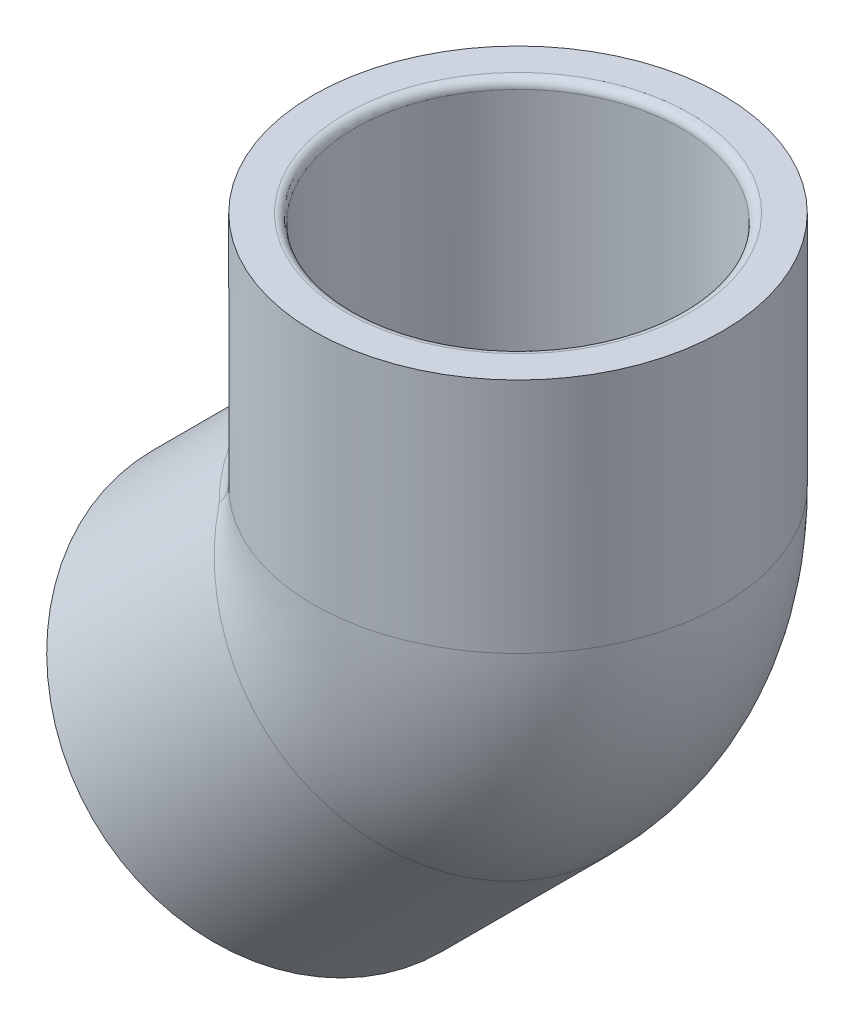
ISO-10303-21;
HEADER;
FILE_DESCRIPTION(('STEP AP214'),'2;1');
FILE_NAME('part.step','',(''),(''),'','','');
FILE_SCHEMA(('AUTOMOTIVE_DESIGN { 1 0 10303 214 1 1 1 1 }'));
ENDSEC;
DATA;
#1=APPLICATION_CONTEXT('core data for automotive mechanical design processes');
#2=APPLICATION_PROTOCOL_DEFINITION('international standard','automotive_design',2000,#1);
#3=PRODUCT_CONTEXT('',#1,'mechanical');
#4=PRODUCT('Part','Part','',(#3));
#5=PRODUCT_RELATED_PRODUCT_CATEGORY('part','',(#4));
#6=PRODUCT_DEFINITION_FORMATION('','',#4);
#7=PRODUCT_DEFINITION_CONTEXT('part definition',#1,'design');
#8=PRODUCT_DEFINITION('design','',#6,#7);
#9=PRODUCT_DEFINITION_SHAPE('','',#8);
#10=(LENGTH_UNIT() NAMED_UNIT(*) SI_UNIT(.MILLI.,.METRE.));
#11=(NAMED_UNIT(*) PLANE_ANGLE_UNIT() SI_UNIT($,.RADIAN.));
#12=(NAMED_UNIT(*) SI_UNIT($,.STERADIAN.) SOLID_ANGLE_UNIT());
#13=UNCERTAINTY_MEASURE_WITH_UNIT(LENGTH_MEASURE(1.E-05),#10,'distance_accuracy_value','');
#14=(GEOMETRIC_REPRESENTATION_CONTEXT(3) GLOBAL_UNCERTAINTY_ASSIGNED_CONTEXT((#13)) GLOBAL_UNIT_ASSIGNED_CONTEXT((#10,
#11,#12)) REPRESENTATION_CONTEXT('',''));
#15=CARTESIAN_POINT('',(0.,0.,0.));
#16=DIRECTION('',(0.,0.,1.));
#17=DIRECTION('',(1.,0.,0.));
#18=AXIS2_PLACEMENT_3D('',#15,#16,#17);
#19=CARTESIAN_POINT('',(-11.2253201513366,-53.8815367264149,0.));
#20=DIRECTION('',(-0.707106781186549,-0.707106781186546,0.));
#21=DIRECTION('',(0.707106781186546,-0.707106781186549,0.));
#22=AXIS2_PLACEMENT_3D('',#19,#20,#21);
#23=PLANE('',#22);
#24=CARTESIAN_POINT('',(-32.5534284388757,-32.5534284388756,0.));
#25=DIRECTION('',(-0.707106781186549,-0.707106781186546,0.));
#26=DIRECTION('',(0.707106781186546,-0.707106781186549,0.));
#27=AXIS2_PLACEMENT_3D('',#24,#25,#26);
#28=CIRCLE('',#27,25.4);
#29=CARTESIAN_POINT('',(-14.5929161967375,-50.513940681014,0.));
#30=VERTEX_POINT('',#29);
#31=EDGE_CURVE('E99',#30,#30,#28,.F.);
#32=ORIENTED_EDGE('',*,*,#31,.T.);
#33=EDGE_LOOP('',(#32));
#34=FACE_BOUND('',#33,.T.);
#35=CARTESIAN_POINT('',(-32.5534284388757,-32.5534284388756,0.));
#36=DIRECTION('',(-0.707106781186549,-0.707106781186546,0.));
#37=DIRECTION('',(0.707106781186546,-0.707106781186549,0.));
#38=AXIS2_PLACEMENT_3D('',#35,#36,#37);
#39=CIRCLE('',#38,30.1625);
#40=CARTESIAN_POINT('',(-11.2253201513366,-53.8815367264149,0.));
#41=VERTEX_POINT('',#40);
#42=EDGE_CURVE('E75',#41,#41,#39,.T.);
#43=ORIENTED_EDGE('',*,*,#42,.T.);
#44=EDGE_LOOP('',(#43));
#45=FACE_BOUND('',#44,.T.);
#46=ADVANCED_FACE('F32',(#34,#45),#23,.T.);
#47=CARTESIAN_POINT('',(-32.5534284388757,-32.5534284388756,0.));
#48=DIRECTION('',(-0.707106781186549,-0.707106781186546,0.));
#49=DIRECTION('',(0.707106781186546,-0.707106781186549,0.));
#50=AXIS2_PLACEMENT_3D('',#47,#48,#49);
#51=CYLINDRICAL_SURFACE('',#50,24.13);
#52=CARTESIAN_POINT('',(-31.6554028267688,-31.6554028267687,0.));
#53=DIRECTION('',(-0.707106781186549,-0.707106781186546,0.));
#54=DIRECTION('',(0.707106781186546,-0.707106781186549,0.));
#55=AXIS2_PLACEMENT_3D('',#52,#53,#54);
#56=CIRCLE('',#55,24.13);
#57=CARTESIAN_POINT('',(-14.5929161967375,-48.7178894568001,0.));
#58=VERTEX_POINT('',#57);
#59=EDGE_CURVE('E96',#58,#58,#56,.T.);
#60=ORIENTED_EDGE('',*,*,#59,.T.);
#61=EDGE_LOOP('',(#60));
#62=FACE_BOUND('',#61,.T.);
#63=CARTESIAN_POINT('',(-7.85772410593552,-7.85772410593549,0.));
#64=DIRECTION('',(-0.707106781186549,-0.707106781186546,0.));
#65=DIRECTION('',(0.707106781186546,-0.707106781186549,0.));
#66=AXIS2_PLACEMENT_3D('',#63,#64,#65);
#67=CIRCLE('',#66,24.13);
#68=CARTESIAN_POINT('',(9.20476252409583,-24.9202107359669,0.));
#69=VERTEX_POINT('',#68);
#70=EDGE_CURVE('E79',#69,#69,#67,.T.);
#71=ORIENTED_EDGE('',*,*,#70,.F.);
#72=EDGE_LOOP('',(#71));
#73=FACE_BOUND('',#72,.T.);
#74=ADVANCED_FACE('F122',(#62,#73),#51,.F.);
#75=CARTESIAN_POINT('',(-32.5534284388757,-32.5534284388756,0.));
#76=DIRECTION('',(-0.707106781186549,-0.707106781186546,0.));
#77=DIRECTION('',(0.707106781186546,-0.707106781186549,0.));
#78=AXIS2_PLACEMENT_3D('',#75,#76,#77);
#79=CYLINDRICAL_SURFACE('',#78,30.1625);
#80=CARTESIAN_POINT('',(-7.85772410593552,-7.8577241059355,0.));
#81=DIRECTION('',(0.707106781186549,0.707106781186546,0.));
#82=DIRECTION('',(-0.707106781186546,0.707106781186549,0.));
#83=AXIS2_PLACEMENT_3D('',#80,#81,#82);
#84=CIRCLE('',#83,30.1625);
#85=CARTESIAN_POINT('',(-23.3930070976355,7.67755888576452,20.6660681065749));
#86=VERTEX_POINT('',#85);
#87=CARTESIAN_POINT('',(-23.3930070976355,7.67755888576453,-20.6660681065749));
#88=VERTEX_POINT('',#87);
#89=EDGE_CURVE('E82',#86,#88,#84,.T.);
#90=ORIENTED_EDGE('',*,*,#89,.F.);
#91=CARTESIAN_POINT('',(0.,0.,0.));
#92=DIRECTION('',(0.311833795922455,0.950136665812131,0.));
#93=DIRECTION('',(0.950136665812131,-0.311833795922455,0.));
#94=AXIS2_PLACEMENT_3D('',#91,#92,#93);
#95=ELLIPSE('',#94,33.8012797196911,30.1625);
#96=EDGE_CURVE('E11',#86,#88,#95,.F.);
#97=ORIENTED_EDGE('',*,*,#96,.T.);
#98=EDGE_LOOP('',(#90,#97));
#99=FACE_BOUND('',#98,.T.);
#100=ORIENTED_EDGE('',*,*,#42,.F.);
#101=EDGE_LOOP('',(#100));
#102=FACE_BOUND('',#101,.T.);
#103=ADVANCED_FACE('F128',(#99,#102),#79,.T.);
#104=CARTESIAN_POINT('',(-7.85772410593552,-7.8577241059355,0.));
#105=DIRECTION('',(0.707106781186549,0.707106781186546,0.));
#106=DIRECTION('',(-0.707106781186546,0.707106781186549,0.));
#107=AXIS2_PLACEMENT_3D('',#104,#105,#106);
#108=PLANE('',#107);
#109=CARTESIAN_POINT('',(-7.85772410593552,-7.8577241059355,0.));
#110=DIRECTION('',(0.707106781186549,0.707106781186546,0.));
#111=DIRECTION('',(-0.707106781186546,0.707106781186549,0.));
#112=AXIS2_PLACEMENT_3D('',#109,#110,#111);
#113=CIRCLE('',#112,18.0975);
#114=CARTESIAN_POINT('',(4.939140866588,-20.6545890784591,0.));
#115=VERTEX_POINT('',#114);
#116=EDGE_CURVE('E149',#115,#115,#113,.T.);
#117=ORIENTED_EDGE('',*,*,#116,.T.);
#118=EDGE_LOOP('',(#117));
#119=FACE_BOUND('',#118,.T.);
#120=ORIENTED_EDGE('',*,*,#70,.T.);
#121=EDGE_LOOP('',(#120));
#122=FACE_BOUND('',#121,.T.);
#123=ADVANCED_FACE('F135',(#119,#122),#108,.F.);
#124=CARTESIAN_POINT('',(-26.827948211871,11.1125,0.));
#125=DIRECTION('',(0.,0.,-1.));
#126=DIRECTION('',(-1.,0.,0.));
#127=AXIS2_PLACEMENT_3D('',#124,#125,#126);
#128=DEGENERATE_TOROIDAL_SURFACE('',#127,26.827948211871,30.1625,.T.);
#129=CARTESIAN_POINT('',(0.,11.1125,0.));
#130=DIRECTION('',(0.,1.,0.));
#131=DIRECTION('',(-1.,0.,0.));
#132=AXIS2_PLACEMENT_3D('',#129,#130,#131);
#133=CIRCLE('',#132,30.1625);
#134=CARTESIAN_POINT('',(-21.9702079021662,11.1125,20.6660681065749));
#135=VERTEX_POINT('',#134);
#136=CARTESIAN_POINT('',(-21.9702079021662,11.1125,-20.6660681065749));
#137=VERTEX_POINT('',#136);
#138=EDGE_CURVE('E71',#135,#137,#133,.T.);
#139=ORIENTED_EDGE('',*,*,#138,.F.);
#140=CARTESIAN_POINT('',(0.,0.,30.1625));
#141=CARTESIAN_POINT('',(0.,0.,30.1625));
#142=CARTESIAN_POINT('',(0.,0.,30.1625));
#143=CARTESIAN_POINT('',(-0.700460831595457,0.229890465099318,30.1624920836448));
#144=CARTESIAN_POINT('',(-0.679161787237688,0.281318023319462,30.1625262585487));
#145=CARTESIAN_POINT('',(-0.657857710778537,0.332743497174967,30.1624920836448));
#146=CARTESIAN_POINT('',(-1.40076448831644,0.459729345579767,30.1409738375808));
#147=CARTESIAN_POINT('',(-1.35830667469442,0.562629046520396,30.1395733360821));
#148=CARTESIAN_POINT('',(-1.31556780630373,0.665412330764075,30.1409738375808));
#149=CARTESIAN_POINT('',(-2.79883257641421,0.918573735609611,30.0549491140271));
#150=CARTESIAN_POINT('',(-2.71339371868768,1.12392447833845,30.0479930241089));
#151=CARTESIAN_POINT('',(-2.62860321165769,1.32954377671897,30.0549491140271));
#152=CARTESIAN_POINT('',(-3.49659692950738,1.14757921946641,29.9904413223232));
#153=CARTESIAN_POINT('',(-3.38961568762119,1.40402478904532,29.9793261662501));
#154=CARTESIAN_POINT('',(-3.28392844796418,1.6610063518973,29.9904413223232));
#155=CARTESIAN_POINT('',(-5.57857650347265,1.83088259775213,29.7329915706843));
#156=CARTESIAN_POINT('',(-5.406322399641,2.23937206049274,29.7054117476464));
#157=CARTESIAN_POINT('',(-5.23927877540043,2.65001977454643,29.7329915706843));
#158=CARTESIAN_POINT('',(-6.95563755955591,2.2828325032622,29.4761220494014));
#159=CARTESIAN_POINT('',(-6.7388386391349,2.79131835897353,29.4319968513309));
#160=CARTESIAN_POINT('',(-6.5325848292076,3.30417214246807,29.4761220494014));
#161=CARTESIAN_POINT('',(-9.6622073063043,3.17112568089264,28.7949979268551));
#162=CARTESIAN_POINT('',(-9.34869610314391,3.87235671642673,28.7104146394436));
#163=CARTESIAN_POINT('',(-9.07453678047196,4.58988783456401,28.7949979268551));
#164=CARTESIAN_POINT('',(-10.99191310983,3.6075336452344,28.3715556082158));
#165=CARTESIAN_POINT('',(-10.6280942188612,4.40230076763141,28.2619828047015));
#166=CARTESIAN_POINT('',(-10.323367802078,5.22154479427024,28.3715556082158));
#167=CARTESIAN_POINT('',(-12.93525022633,4.24533472333214,27.6155879407951));
#168=CARTESIAN_POINT('',(-12.4872330502061,5.17238128590894,27.4669827684332));
#169=CARTESIAN_POINT('',(-12.1485081226576,6.14469818010792,27.6155879407951));
#170=CARTESIAN_POINT('',(-13.5725458656443,4.45449444264717,27.3445165239495));
#171=CARTESIAN_POINT('',(-13.0964249616421,5.42471683771372,27.1819630363369));
#172=CARTESIAN_POINT('',(-12.7470424467161,6.44743599240893,27.3445165239495));
#173=CARTESIAN_POINT('',(-14.8292804697611,4.86695334058256,26.7626264426639));
#174=CARTESIAN_POINT('',(-14.2948491763805,5.92112040093472,26.5717330531804));
#175=CARTESIAN_POINT('',(-13.9273404911298,7.04442906944092,26.7626264426639));
#176=CARTESIAN_POINT('',(-15.4487231226625,5.07025372963283,26.451816060738));
#177=CARTESIAN_POINT('',(-14.8842041083656,6.16523920681437,26.2463391784631));
#178=CARTESIAN_POINT('',(-14.5091076752678,7.33868608614835,26.451816060738));
#179=CARTESIAN_POINT('',(-16.6620419136698,5.4684636060409,25.7939156352507));
#180=CARTESIAN_POINT('',(-16.0354758005896,6.64211155570977,25.5595459196288));
#181=CARTESIAN_POINT('',(-15.6486305240737,7.91505512706705,25.7939156352507));
#182=CARTESIAN_POINT('',(-17.2560879279125,5.6634288465577,25.4471490677351));
#183=CARTESIAN_POINT('',(-16.5976683809079,6.87497934714316,25.1982677729244));
#184=CARTESIAN_POINT('',(-16.2065457327467,8.19724784840986,25.4471490677351));
#185=CARTESIAN_POINT('',(-18.4212846662527,6.04584511885522,24.7161690936644));
#186=CARTESIAN_POINT('',(-17.6971879537199,7.33041526629658,24.4390303405605));
#187=CARTESIAN_POINT('',(-17.3008733872211,8.75075722412895,24.7161690936644));
#188=CARTESIAN_POINT('',(-18.9924406730066,6.23329788439797,24.3319643983004));
#189=CARTESIAN_POINT('',(-18.2345529358977,7.552999129859,24.0408904261862));
#190=CARTESIAN_POINT('',(-17.8372907943797,9.02207638795266,24.3319643983004));
#191=CARTESIAN_POINT('',(-20.1040382185953,6.59812296130698,23.5308842258522));
#192=CARTESIAN_POINT('',(-19.2771151812316,7.98484255149445,23.2134782815492));
#193=CARTESIAN_POINT('',(-18.8812792426451,9.55012426455948,23.5308842258522));
#194=CARTESIAN_POINT('',(-20.644719264376,6.77557387858625,23.1143523213424));
#195=CARTESIAN_POINT('',(-19.78257342913,8.19421021298729,22.7843506131201));
#196=CARTESIAN_POINT('',(-19.3890752235116,9.80696675155408,23.1143523213424));
#197=CARTESIAN_POINT('',(-21.6983985113901,7.12139023438418,22.2467788330612));
#198=CARTESIAN_POINT('',(-20.7644044900852,8.60089795439408,21.8935809717675));
#199=CARTESIAN_POINT('',(-20.3786680545008,10.3075014020834,22.2467788330612));
#200=CARTESIAN_POINT('',(-22.2114032950394,7.28975783324435,21.7957455172257));
#201=CARTESIAN_POINT('',(-21.2407322072117,8.79819935496211,21.4317941493994));
#202=CARTESIAN_POINT('',(-20.8604710866864,10.5511966924968,21.7957455172257));
#203=CARTESIAN_POINT('',(-23.2022689133758,7.61495882604129,20.8651458346211));
#204=CARTESIAN_POINT('',(-22.1576310702755,9.1779912993676,20.4823830065094));
#205=CARTESIAN_POINT('',(-21.791070711912,11.0218926632117,20.8651458346211));
#206=CARTESIAN_POINT('',(-23.6804298021673,7.77189069740103,20.3859097735687));
#207=CARTESIAN_POINT('',(-22.5984385838443,9.36057974988378,19.9949260782647));
#208=CARTESIAN_POINT('',(-22.2401491092974,11.2490358797516,20.3859097735687));
#209=CARTESIAN_POINT('',(-24.6045500445488,8.07518593211792,19.3965648993251));
#210=CARTESIAN_POINT('',(-23.4474557721385,9.71225418396312,18.9921972224219));
#211=CARTESIAN_POINT('',(-23.108062916487,11.6880254526015,19.3965648993251));
#212=CARTESIAN_POINT('',(-25.050517402102,8.22155192236689,18.8864638181787));
#213=CARTESIAN_POINT('',(-23.855551427393,9.88129293911506,18.4768467999678));
#214=CARTESIAN_POINT('',(-23.5269058434409,11.8998756110751,18.8864638181787));
#215=CARTESIAN_POINT('',(-25.9036733431102,8.50155675237832,17.8422339403316));
#216=CARTESIAN_POINT('',(-24.6335726028366,10.2035598617972,17.425666130774));
#217=CARTESIAN_POINT('',(-24.3281715088034,12.3051546483055,17.8422339403316));
#218=CARTESIAN_POINT('',(-26.3112004162958,8.63530668409353,17.3083910667283));
#219=CARTESIAN_POINT('',(-25.0036998434039,10.3568715846439,16.8900280598694));
#220=CARTESIAN_POINT('',(-24.7109121494691,12.498744321573,17.3083910667283));
#221=CARTESIAN_POINT('',(-27.0899307366124,8.89088510825282,16.2141842362958));
#222=CARTESIAN_POINT('',(-25.7086132487201,10.6488562774245,15.7959788641958));
#223=CARTESIAN_POINT('',(-25.4422788765285,12.8686685749365,16.2141842362958));
#224=CARTESIAN_POINT('',(-27.4611433121259,9.01271666226168,15.6538271455406));
#225=CARTESIAN_POINT('',(-26.0432412289582,10.7874637251887,15.2375775661686));
#226=CARTESIAN_POINT('',(-25.790913723938,13.0450075863417,15.6538271455406));
#227=CARTESIAN_POINT('',(-28.1619566777856,9.24272282864835,14.5138105202211));
#228=CARTESIAN_POINT('',(-26.6729732560331,11.0483072714638,14.1053829806415));
#229=CARTESIAN_POINT('',(-26.4491025271089,13.3779185495791,14.5138105202211));
#230=CARTESIAN_POINT('',(-28.4919009581923,9.35101017414727,13.9343692999482));
#231=CARTESIAN_POINT('',(-26.9682368757917,11.1706094672432,13.531810216934));
#232=CARTESIAN_POINT('',(-26.7589790815172,13.5346536713494,13.9343692999482));
#233=CARTESIAN_POINT('',(-29.1118910268554,9.55449022444104,12.7540123391813));
#234=CARTESIAN_POINT('',(-27.5214425226457,11.3997547489515,12.3670722506256));
#235=CARTESIAN_POINT('',(-27.341260386736,13.8291707297704,12.7540123391813));
#236=CARTESIAN_POINT('',(-29.4019473060266,9.6496863723425,12.1531022977682));
#237=CARTESIAN_POINT('',(-27.7792140753792,11.5065272220877,11.7760142915221));
#238=CARTESIAN_POINT('',(-27.6136749903877,13.9669576499742,12.1531022977682));
#239=CARTESIAN_POINT('',(-29.938383730394,9.82574420959962,10.9367982922949));
#240=CARTESIAN_POINT('',(-28.2547040162132,11.7034816043531,10.5830716418149));
#241=CARTESIAN_POINT('',(-28.1174845143389,14.2217837927143,10.9367982922949));
#242=CARTESIAN_POINT('',(-30.1850715486827,9.90670687692174,10.321544624803));
#243=CARTESIAN_POINT('',(-28.4725364964071,11.7937107719748,9.9814383535379));
#244=CARTESIAN_POINT('',(-28.3491683945734,14.338969170776,10.321544624803));
#245=CARTESIAN_POINT('',(-30.6356838134131,10.0545973205349,9.07523479075941));
#246=CARTESIAN_POINT('',(-28.8695791882352,11.9581712397711,8.76572229620404));
#247=CARTESIAN_POINT('',(-28.7723737182016,14.5530258233011,9.07523479075941));
#248=CARTESIAN_POINT('',(-30.8396196316246,10.1215288290281,8.44418287656583));
#249=CARTESIAN_POINT('',(-29.048640184286,12.0323407328274,8.15183799223338));
#250=CARTESIAN_POINT('',(-28.9639058417164,14.6499024997547,8.44418287656583));
#251=CARTESIAN_POINT('',(-31.202433208872,10.2406038411566,7.17249867671775));
#252=CARTESIAN_POINT('',(-29.3666663396699,12.1640714795768,6.91725622699186));
#253=CARTESIAN_POINT('',(-29.3046525310405,14.8222516919869,7.17249867671775));
#254=CARTESIAN_POINT('',(-31.361546981272,10.2928248041152,6.53193600946938));
#255=CARTESIAN_POINT('',(-29.5057061818741,12.221663667928,6.29684058679351));
#256=CARTESIAN_POINT('',(-29.4540887555129,14.897836322403,6.53193600946938));
#257=CARTESIAN_POINT('',(-31.6350557844287,10.3825900888111,5.24101415042203));
#258=CARTESIAN_POINT('',(-29.7444448699159,12.320552470378,5.04840438856609));
#259=CARTESIAN_POINT('',(-29.7109623264628,15.0277626103058,5.24101415042203));
#260=CARTESIAN_POINT('',(-31.7494509966516,10.4201344701052,4.5906549983879));
#261=CARTESIAN_POINT('',(-29.8440346639434,12.3618039137382,4.42065083116858));
#262=CARTESIAN_POINT('',(-29.8183998433694,15.0821043539953,4.5906549983879));
#263=CARTESIAN_POINT('',(-31.9324452848083,10.4801929917488,3.28521586855289));
#264=CARTESIAN_POINT('',(-30.0032671502522,12.4277601691377,3.16178370825199));
#265=CARTESIAN_POINT('',(-29.9902641333656,15.1690330681471,3.28521586855289));
#266=CARTESIAN_POINT('',(-32.0011750136513,10.5027500122375,2.6301548264878));
#267=CARTESIAN_POINT('',(-30.0629484470351,12.4524809716851,2.53097373531347));
#268=CARTESIAN_POINT('',(-30.0548136128505,15.2016821033301,2.6301548264878));
#269=CARTESIAN_POINT('',(-32.0928699453902,10.5328441867493,1.31672918649753));
#270=CARTESIAN_POINT('',(-30.142584223314,12.48546719027,1.26662381305121));
#271=CARTESIAN_POINT('',(-30.1409315157551,15.2452404164917,1.31672918649753));
#272=CARTESIAN_POINT('',(-32.1158352130505,10.540381362028,0.658364593248769));
#273=CARTESIAN_POINT('',(-30.1625,12.4937165750785,0.633389703799662));
#274=CARTESIAN_POINT('',(-30.1625,15.2561497252355,0.658364593248769));
#275=CARTESIAN_POINT('',(-32.1158352130505,10.540381362028,-0.658364593248762));
#276=CARTESIAN_POINT('',(-30.1625,12.4937165750785,-0.633389703799654));
#277=CARTESIAN_POINT('',(-30.1625,15.2561497252355,-0.658364593248762));
#278=CARTESIAN_POINT('',(-32.0928699453902,10.5328441867493,-1.31672918649753));
#279=CARTESIAN_POINT('',(-30.142584223314,12.48546719027,-1.26662381305121));
#280=CARTESIAN_POINT('',(-30.1409315157551,15.2452404164917,-1.31672918649753));
#281=CARTESIAN_POINT('',(-32.0011750136513,10.5027500122375,-2.63015482648779));
#282=CARTESIAN_POINT('',(-30.0629484470351,12.4524809716851,-2.53097373531347));
#283=CARTESIAN_POINT('',(-30.0548136128506,15.2016821033301,-2.63015482648779));
#284=CARTESIAN_POINT('',(-31.9324452848083,10.4801929917488,-3.28521586855288));
#285=CARTESIAN_POINT('',(-30.0032671502522,12.4277601691377,-3.16178370825198));
#286=CARTESIAN_POINT('',(-29.9902641333656,15.1690330681471,-3.28521586855289));
#287=CARTESIAN_POINT('',(-31.7494509966516,10.4201344701052,-4.5906549983879));
#288=CARTESIAN_POINT('',(-29.8440346639434,12.3618039137382,-4.42065083116857));
#289=CARTESIAN_POINT('',(-29.8183998433694,15.0821043539953,-4.5906549983879));
#290=CARTESIAN_POINT('',(-31.6350557844287,10.3825900888111,-5.24101415042202));
#291=CARTESIAN_POINT('',(-29.7444448699159,12.320552470378,-5.04840438856608));
#292=CARTESIAN_POINT('',(-29.7109623264628,15.0277626103058,-5.24101415042202));
#293=CARTESIAN_POINT('',(-31.361546981272,10.2928248041152,-6.53193600946937));
#294=CARTESIAN_POINT('',(-29.5057061818741,12.221663667928,-6.2968405867935));
#295=CARTESIAN_POINT('',(-29.4540887555129,14.897836322403,-6.53193600946937));
#296=CARTESIAN_POINT('',(-31.202433208872,10.2406038411566,-7.17249867671774));
#297=CARTESIAN_POINT('',(-29.3666663396699,12.1640714795768,-6.91725622699185));
#298=CARTESIAN_POINT('',(-29.3046525310405,14.8222516919869,-7.17249867671774));
#299=CARTESIAN_POINT('',(-30.8396196316246,10.1215288290281,-8.44418287656583));
#300=CARTESIAN_POINT('',(-29.048640184286,12.0323407328274,-8.15183799223338));
#301=CARTESIAN_POINT('',(-28.9639058417164,14.6499024997547,-8.44418287656583));
#302=CARTESIAN_POINT('',(-30.6356838134131,10.0545973205349,-9.07523479075941));
#303=CARTESIAN_POINT('',(-28.8695791882352,11.9581712397711,-8.76572229620404));
#304=CARTESIAN_POINT('',(-28.7723737182016,14.5530258233011,-9.0752347907594));
#305=CARTESIAN_POINT('',(-30.1850715486827,9.90670687692174,-10.321544624803));
#306=CARTESIAN_POINT('',(-28.4725364964071,11.7937107719748,-9.98143835353789));
#307=CARTESIAN_POINT('',(-28.3491683945734,14.338969170776,-10.321544624803));
#308=CARTESIAN_POINT('',(-29.938383730394,9.82574420959962,-10.9367982922949));
#309=CARTESIAN_POINT('',(-28.2547040162132,11.7034816043531,-10.5830716418149));
#310=CARTESIAN_POINT('',(-28.1174845143389,14.2217837927143,-10.9367982922949));
#311=CARTESIAN_POINT('',(-29.4019473060266,9.6496863723425,-12.1531022977682));
#312=CARTESIAN_POINT('',(-27.7792140753792,11.5065272220877,-11.7760142915221));
#313=CARTESIAN_POINT('',(-27.6136749903877,13.9669576499742,-12.1531022977682));
#314=CARTESIAN_POINT('',(-29.1118910268554,9.55449022444105,-12.7540123391813));
#315=CARTESIAN_POINT('',(-27.5214425226458,11.3997547489515,-12.3670722506256));
#316=CARTESIAN_POINT('',(-27.3412603867361,13.8291707297705,-12.7540123391813));
#317=CARTESIAN_POINT('',(-28.4919009581924,9.35101017414728,-13.9343692999482));
#318=CARTESIAN_POINT('',(-26.9682368757917,11.1706094672432,-13.531810216934));
#319=CARTESIAN_POINT('',(-26.7589790815172,13.5346536713494,-13.9343692999482));
#320=CARTESIAN_POINT('',(-28.1619566777856,9.24272282864836,-14.5138105202211));
#321=CARTESIAN_POINT('',(-26.6729732560331,11.0483072714638,-14.1053829806415));
#322=CARTESIAN_POINT('',(-26.4491025271089,13.3779185495791,-14.5138105202211));
#323=CARTESIAN_POINT('',(-27.4611433121259,9.01271666226168,-15.6538271455406));
#324=CARTESIAN_POINT('',(-26.0432412289582,10.7874637251887,-15.2375775661686));
#325=CARTESIAN_POINT('',(-25.790913723938,13.0450075863417,-15.6538271455406));
#326=CARTESIAN_POINT('',(-27.0899307366124,8.89088510825283,-16.2141842362958));
#327=CARTESIAN_POINT('',(-25.7086132487201,10.6488562774245,-15.7959788641958));
#328=CARTESIAN_POINT('',(-25.4422788765285,12.8686685749365,-16.2141842362958));
#329=CARTESIAN_POINT('',(-26.3112004162958,8.63530668409354,-17.3083910667283));
#330=CARTESIAN_POINT('',(-25.0036998434039,10.3568715846439,-16.8900280598694));
#331=CARTESIAN_POINT('',(-24.7109121494691,12.498744321573,-17.3083910667283));
#332=CARTESIAN_POINT('',(-25.9036733431102,8.50155675237832,-17.8422339403316));
#333=CARTESIAN_POINT('',(-24.6335726028366,10.2035598617972,-17.425666130774));
#334=CARTESIAN_POINT('',(-24.3281715088034,12.3051546483055,-17.8422339403315));
#335=CARTESIAN_POINT('',(-25.050517402102,8.22155192236689,-18.8864638181787));
#336=CARTESIAN_POINT('',(-23.855551427393,9.88129293911506,-18.4768467999677));
#337=CARTESIAN_POINT('',(-23.5269058434409,11.8998756110751,-18.8864638181787));
#338=CARTESIAN_POINT('',(-24.6045500445488,8.07518593211792,-19.3965648993251));
#339=CARTESIAN_POINT('',(-23.4474557721385,9.71225418396311,-18.9921972224219));
#340=CARTESIAN_POINT('',(-23.108062916487,11.6880254526015,-19.3965648993251));
#341=CARTESIAN_POINT('',(-23.6804298021673,7.77189069740102,-20.3859097735687));
#342=CARTESIAN_POINT('',(-22.5984385838443,9.36057974988378,-19.9949260782647));
#343=CARTESIAN_POINT('',(-22.2401491092974,11.2490358797516,-20.3859097735687));
#344=CARTESIAN_POINT('',(-23.2022689133758,7.6149588260413,-20.8651458346211));
#345=CARTESIAN_POINT('',(-22.1576310702755,9.1779912993676,-20.4823830065094));
#346=CARTESIAN_POINT('',(-21.791070711912,11.0218926632118,-20.8651458346211));
#347=CARTESIAN_POINT('',(-22.2114032950394,7.28975783324436,-21.7957455172257));
#348=CARTESIAN_POINT('',(-21.2407322072117,8.79819935496212,-21.4317941493994));
#349=CARTESIAN_POINT('',(-20.8604710866864,10.5511966924968,-21.7957455172257));
#350=CARTESIAN_POINT('',(-21.6983985113901,7.12139023438419,-22.2467788330612));
#351=CARTESIAN_POINT('',(-20.7644044900852,8.60089795439409,-21.8935809717674));
#352=CARTESIAN_POINT('',(-20.3786680545008,10.3075014020834,-22.2467788330612));
#353=CARTESIAN_POINT('',(-20.644719264376,6.77557387858626,-23.1143523213424));
#354=CARTESIAN_POINT('',(-19.78257342913,8.1942102129873,-22.7843506131201));
#355=CARTESIAN_POINT('',(-19.3890752235116,9.80696675155408,-23.1143523213424));
#356=CARTESIAN_POINT('',(-20.1040382185953,6.59812296130698,-23.5308842258522));
#357=CARTESIAN_POINT('',(-19.2771151812316,7.98484255149445,-23.2134782815492));
#358=CARTESIAN_POINT('',(-18.8812792426451,9.55012426455948,-23.5308842258522));
#359=CARTESIAN_POINT('',(-18.9924406730067,6.23329788439797,-24.3319643983004));
#360=CARTESIAN_POINT('',(-18.2345529358977,7.552999129859,-24.0408904261862));
#361=CARTESIAN_POINT('',(-17.8372907943798,9.02207638795267,-24.3319643983004));
#362=CARTESIAN_POINT('',(-18.4212846662527,6.04584511885523,-24.7161690936644));
#363=CARTESIAN_POINT('',(-17.6971879537199,7.33041526629658,-24.4390303405605));
#364=CARTESIAN_POINT('',(-17.3008733872211,8.75075722412896,-24.7161690936643));
#365=CARTESIAN_POINT('',(-17.2560879279126,5.66342884655771,-25.4471490677351));
#366=CARTESIAN_POINT('',(-16.5976683809079,6.87497934714317,-25.1982677729243));
#367=CARTESIAN_POINT('',(-16.2065457327467,8.19724784840987,-25.4471490677351));
#368=CARTESIAN_POINT('',(-16.6620419136698,5.46846360604091,-25.7939156352507));
#369=CARTESIAN_POINT('',(-16.0354758005896,6.64211155570978,-25.5595459196288));
#370=CARTESIAN_POINT('',(-15.6486305240737,7.91505512706706,-25.7939156352507));
#371=CARTESIAN_POINT('',(-15.4487231226625,5.07025372963284,-26.451816060738));
#372=CARTESIAN_POINT('',(-14.8842041083656,6.16523920681438,-26.2463391784631));
#373=CARTESIAN_POINT('',(-14.5091076752678,7.33868608614836,-26.451816060738));
#374=CARTESIAN_POINT('',(-14.8292804697612,4.86695334058257,-26.7626264426639));
#375=CARTESIAN_POINT('',(-14.2948491763806,5.92112040093472,-26.5717330531804));
#376=CARTESIAN_POINT('',(-13.9273404911298,7.04442906944093,-26.7626264426639));
#377=CARTESIAN_POINT('',(-13.5725458656443,4.45449444264717,-27.3445165239495));
#378=CARTESIAN_POINT('',(-13.0964249616421,5.42471683771372,-27.1819630363369));
#379=CARTESIAN_POINT('',(-12.7470424467161,6.44743599240893,-27.3445165239495));
#380=CARTESIAN_POINT('',(-12.93525022633,4.24533472333214,-27.6155879407951));
#381=CARTESIAN_POINT('',(-12.4872330502061,5.17238128590895,-27.4669827684332));
#382=CARTESIAN_POINT('',(-12.1485081226576,6.14469818010792,-27.6155879407951));
#383=CARTESIAN_POINT('',(-10.99191310983,3.60753364523441,-28.3715556082158));
#384=CARTESIAN_POINT('',(-10.6280942188612,4.40230076763141,-28.2619828047015));
#385=CARTESIAN_POINT('',(-10.323367802078,5.22154479427024,-28.3715556082158));
#386=CARTESIAN_POINT('',(-9.6622073063043,3.17112568089264,-28.7949979268551));
#387=CARTESIAN_POINT('',(-9.34869610314391,3.87235671642673,-28.7104146394436));
#388=CARTESIAN_POINT('',(-9.07453678047196,4.58988783456401,-28.7949979268551));
#389=CARTESIAN_POINT('',(-6.95563755955592,2.2828325032622,-29.4761220494014));
#390=CARTESIAN_POINT('',(-6.7388386391349,2.79131835897353,-29.4319968513309));
#391=CARTESIAN_POINT('',(-6.5325848292076,3.30417214246807,-29.4761220494014));
#392=CARTESIAN_POINT('',(-5.57857650347265,1.83088259775213,-29.7329915706843));
#393=CARTESIAN_POINT('',(-5.406322399641,2.23937206049273,-29.7054117476464));
#394=CARTESIAN_POINT('',(-5.23927877540044,2.65001977454643,-29.7329915706843));
#395=CARTESIAN_POINT('',(-3.49659692950738,1.14757921946641,-29.9904413223232));
#396=CARTESIAN_POINT('',(-3.38961568762119,1.40402478904532,-29.9793261662501));
#397=CARTESIAN_POINT('',(-3.28392844796418,1.6610063518973,-29.9904413223232));
#398=CARTESIAN_POINT('',(-2.79883257641421,0.918573735609613,-30.0549491140271));
#399=CARTESIAN_POINT('',(-2.71339371868768,1.12392447833846,-30.0479930241089));
#400=CARTESIAN_POINT('',(-2.62860321165769,1.32954377671898,-30.0549491140271));
#401=CARTESIAN_POINT('',(-1.40076448831645,0.45972934557977,-30.1409738375808));
#402=CARTESIAN_POINT('',(-1.35830667469442,0.562629046520399,-30.1395733360821));
#403=CARTESIAN_POINT('',(-1.31556780630373,0.665412330764078,-30.1409738375808));
#404=CARTESIAN_POINT('',(-0.700460831595466,0.229890465099321,-30.1624920836448));
#405=CARTESIAN_POINT('',(-0.679161787237695,0.281318023319465,-30.1625262585487));
#406=CARTESIAN_POINT('',(-0.657857710778545,0.332743497174971,-30.1624920836448));
#407=CARTESIAN_POINT('',(0.,0.,-30.1625));
#408=CARTESIAN_POINT('',(0.,0.,-30.1625));
#409=CARTESIAN_POINT('',(0.,0.,-30.1625));
#410=(BOUNDED_SURFACE() B_SPLINE_SURFACE(3,2,((#140,#141,#142),(#143,#144,#145),(#146,#147,
#148),(#149,#150,#151),(#152,#153,#154),(#155,#156,#157),(#158,#159,#160),(#161,#162,#163),
(#164,#165,#166),(#167,#168,#169),(#170,#171,#172),(#173,#174,#175),(#176,#177,#178),(#179,#180,
#181),(#182,#183,#184),(#185,#186,#187),(#188,#189,#190),(#191,#192,#193),(#194,#195,#196),
(#197,#198,#199),(#200,#201,#202),(#203,#204,#205),(#206,#207,#208),(#209,#210,#211),(#212,#213,
#214),(#215,#216,#217),(#218,#219,#220),(#221,#222,#223),(#224,#225,#226),(#227,#228,#229),
(#230,#231,#232),(#233,#234,#235),(#236,#237,#238),(#239,#240,#241),(#242,#243,#244),(#245,#246,
#247),(#248,#249,#250),(#251,#252,#253),(#254,#255,#256),(#257,#258,#259),(#260,#261,#262),
(#263,#264,#265),(#266,#267,#268),(#269,#270,#271),(#272,#273,#274),(#275,#276,#277),(#278,#279,
#280),(#281,#282,#283),(#284,#285,#286),(#287,#288,#289),(#290,#291,#292),(#293,#294,#295),
(#296,#297,#298),(#299,#300,#301),(#302,#303,#304),(#305,#306,#307),(#308,#309,#310),(#311,#312,
#313),(#314,#315,#316),(#317,#318,#319),(#320,#321,#322),(#323,#324,#325),(#326,#327,#328),
(#329,#330,#331),(#332,#333,#334),(#335,#336,#337),(#338,#339,#340),(#341,#342,#343),(#344,#345,
#346),(#347,#348,#349),(#350,#351,#352),(#353,#354,#355),(#356,#357,#358),(#359,#360,#361),
(#362,#363,#364),(#365,#366,#367),(#368,#369,#370),(#371,#372,#373),(#374,#375,#376),(#377,#378,
#379),(#380,#381,#382),(#383,#384,#385),(#386,#387,#388),(#389,#390,#391),(#392,#393,#394),
(#395,#396,#397),(#398,#399,#400),(#401,#402,#403),(#404,#405,#406),(#407,#408,#409)),
.UNSPECIFIED.,.F.,.F.,.F.) B_SPLINE_SURFACE_WITH_KNOTS((4,2,2,2,2,2,2,2,2,2,2,2,2,2,2,2,2,2,2,2,
2,2,2,2,2,2,2,2,2,2,2,2,2,2,2,2,2,2,2,2,2,2,2,2,4),(3,3),(0.,2.60771359414475,5.21550691118867,
10.4157073769629,15.5908576068792,18.1621282079621,20.7328637680815,23.2822037247756,
25.8309519051371,28.3555810221872,30.8796070198345,33.3784013692137,35.8765723127286,
38.3501539554971,40.8230985127072,43.2738536362646,45.7239629506179,48.1559194824136,
50.5872283055749,53.0054848307779,55.4237315426919,57.8350293008961,60.2463236467045,
62.657617992513,65.0689157507172,67.4871624626311,69.9054189878342,72.3367278109955,
74.7686843427911,77.2187936571444,79.6695487807018,82.1424933379119,84.6160749806805,
87.1142459241953,89.6130402735746,92.1370662712219,94.6616953882719,97.2104435686335,
99.7597835253276,102.330519085447,104.90178968653,110.076939916446,115.27714038222,
117.884933699264,120.492647293409),(0.,1.),
.UNSPECIFIED.) GEOMETRIC_REPRESENTATION_ITEM() RATIONAL_B_SPLINE_SURFACE(((1.,1.,1.),(1.,
1.00000026789921,1.),(1.,0.999895447337248,1.),(1.,0.999478423225649,1.),(1.,0.999166213336009,
1.),(1.,0.99792514618137,1.),(1.,0.996691816441197,1.),(1.,0.993481693322695,1.),(1.,
0.991508509952665,1.),(1.,0.98808082316444,1.),(1.,0.986864877668545,1.),(1.,0.984293732741837,
1.),(1.,0.982938562340227,1.),(1.,0.98012018098648,1.),(1.,0.97865796309972,1.),(1.,
0.975637693991427,1.),(1.,0.974079665094404,1.),(1.,0.970906659508735,1.),(1.,0.969292361244781,
1.),(1.,0.966019085916772,1.),(1.,0.964360119618354,1.),(1.,0.961041391451317,1.),(1.,
0.95938180331913,1.),(1.,0.956074226759623,1.),(1.,0.954426235541673,1.),(1.,0.951186919698606,
1.),(1.,0.949595196971165,1.),(1.,0.946481167365657,1.),(1.,0.944958842714715,1.),(1.,
0.942025540151901,1.),(1.,0.940613685705417,1.),(1.,0.937914339380091,1.),(1.,0.936626814827965,
1.),(1.,0.934210861697135,1.),(1.,0.933081325057232,1.),(1.,0.930993801598256,1.),(1.,
0.930035769170041,1.),(1.,0.928315924441976,1.),(1.,0.92755308635965,1.),(1.,0.926233408492111,
1.),(1.,0.925676567870969,1.),(1.,0.924782407147881,1.),(1.,0.924444460840663,1.),(1.,
0.923993023681187,1.),(1.,0.923879532511287,1.),(1.,0.923879532511287,1.),(1.,0.923993023681187,
1.),(1.,0.924444460840663,1.),(1.,0.924782407147881,1.),(1.,0.925676567870969,1.),(1.,
0.926233408492111,1.),(1.,0.92755308635965,1.),(1.,0.928315924441976,1.),(1.,0.930035769170041,
1.),(1.,0.930993801598256,1.),(1.,0.933081325057232,1.),(1.,0.934210861697135,1.),(1.,
0.936626814827965,1.),(1.,0.937914339380091,1.),(1.,0.940613685705417,1.),(1.,0.942025540151901,
1.),(1.,0.944958842714715,1.),(1.,0.946481167365657,1.),(1.,0.949595196971165,1.),(1.,
0.951186919698606,1.),(1.,0.954426235541673,1.),(1.,0.956074226759623,1.),(1.,0.95938180331913,
1.),(1.,0.961041391451317,1.),(1.,0.964360119618354,1.),(1.,0.966019085916772,1.),(1.,
0.969292361244781,1.),(1.,0.970906659508735,1.),(1.,0.974079665094404,1.),(1.,0.975637693991427,
1.),(1.,0.97865796309972,1.),(1.,0.98012018098648,1.),(1.,0.982938562340227,1.),(1.,
0.984293732741837,1.),(1.,0.986864877668545,1.),(1.,0.98808082316444,1.),(1.,0.991508509952665,
1.),(1.,0.993481693322695,1.),(1.,0.996691816441197,1.),(1.,0.99792514618137,1.),(1.,
0.999166213336009,1.),(1.,0.999478423225649,1.),(1.,0.999895447337248,1.),(1.,1.00000026789921,
1.),(1.,1.,1.))) REPRESENTATION_ITEM('') SURFACE());
#411=CARTESIAN_POINT('',(-21.9702079021662,11.1125,20.6660681065749));
#412=CARTESIAN_POINT('',(-21.9711115399843,11.1029806855464,20.665107408077));
#413=CARTESIAN_POINT('',(-21.9720368100368,11.0934625072839,20.6641533733962));
#414=CARTESIAN_POINT('',(-21.9882379583895,10.9306289879325,20.6479445888603));
#415=CARTESIAN_POINT('',(-22.0091026076092,10.7776386816806,20.6344221686037));
#416=CARTESIAN_POINT('',(-22.0619454717332,10.4732356944813,20.6111573349062));
#417=CARTESIAN_POINT('',(-22.0939300514594,10.3218239683134,20.601417093081));
#418=CARTESIAN_POINT('',(-22.1690843553109,10.0212490885905,20.5857385054666));
#419=CARTESIAN_POINT('',(-22.2122775922699,9.87209136788954,20.5798082440239));
#420=CARTESIAN_POINT('',(-22.3095860126348,9.57721056048115,20.571910648433));
#421=CARTESIAN_POINT('',(-22.3637054774592,9.43148884524051,20.5699448710878));
#422=CARTESIAN_POINT('',(-22.4825975147242,9.14445807641516,20.5699448710887));
#423=CARTESIAN_POINT('',(-22.5473700871647,9.00314902283044,20.5719106484348));
#424=CARTESIAN_POINT('',(-22.6870748618212,8.72582936036519,20.5798082440222));
#425=CARTESIAN_POINT('',(-22.7620030668435,8.58981669383804,20.5857385054607));
#426=CARTESIAN_POINT('',(-22.9213994846533,8.32413604023719,20.6014170930854));
#427=CARTESIAN_POINT('',(-23.0058472297488,8.19445526868721,20.6111573349251));
#428=CARTESIAN_POINT('',(-23.183727098652,7.94184430466624,20.6344221686219));
#429=CARTESIAN_POINT('',(-23.27715404672,7.81891028671746,20.6479445888634));
#430=CARTESIAN_POINT('',(-23.3808387905963,7.69231365911832,20.6641533733964));
#431=CARTESIAN_POINT('',(-23.3869148942619,7.68492902599582,20.665107408077));
#432=CARTESIAN_POINT('',(-23.3930070976355,7.67755888576447,20.6660681065749));
#433=B_SPLINE_CURVE_WITH_KNOTS('',3,(#411,#412,#413,#414,#415,#416,#417,#418,#419,#420,#421,
#422,#423,#424,#425,#426,#427,#428,#429,#430,#431,#432),.UNSPECIFIED.,.F.,.F.,(4,2,2,2,2,2,2,2,
2,2,4),(0.,0.0288314240465916,0.49330263837494,0.958040145455199,1.4237605440841,
1.88966378967368,2.35556703526298,2.82128743389208,3.28602494097537,3.75049615530132,
3.77932757934824),.UNSPECIFIED.);
#434=EDGE_CURVE('E46',#135,#86,#433,.T.);
#435=ORIENTED_EDGE('',*,*,#434,.T.);
#436=ORIENTED_EDGE('',*,*,#89,.T.);
#437=CARTESIAN_POINT('',(-23.3930070976355,7.67755888576449,-20.6660681065749));
#438=CARTESIAN_POINT('',(-23.3869148942625,7.68492902599592,-20.6651074080765));
#439=CARTESIAN_POINT('',(-23.3808387905975,7.69231365911849,-20.6641533733954));
#440=CARTESIAN_POINT('',(-23.2771540467275,7.81891028672226,-20.647944588854));
#441=CARTESIAN_POINT('',(-23.1837270986587,7.94184430467119,-20.6344221686131));
#442=CARTESIAN_POINT('',(-23.0058472297584,8.19445526869398,-20.6111573349125));
#443=CARTESIAN_POINT('',(-22.9213994846668,8.3241360402456,-20.6014170930684));
#444=CARTESIAN_POINT('',(-22.7620030668533,8.5898166938444,-20.5857385054482));
#445=CARTESIAN_POINT('',(-22.6870748618235,8.72582936036785,-20.5798082440187));
#446=CARTESIAN_POINT('',(-22.5473700871628,9.00314902283033,-20.5719106484366));
#447=CARTESIAN_POINT('',(-22.4825975147255,9.14445807641595,-20.5699448710871));
#448=CARTESIAN_POINT('',(-22.3637054774578,9.43148884523968,-20.5699448710895));
#449=CARTESIAN_POINT('',(-22.3095860126274,9.57721056047779,-20.5719106484416));
#450=CARTESIAN_POINT('',(-22.2122775922738,9.87209136788935,-20.57980824402));
#451=CARTESIAN_POINT('',(-22.169084355332,10.021249088596,-20.5857385054433));
#452=CARTESIAN_POINT('',(-22.0939300514823,10.3218239683202,-20.6014170930555));
#453=CARTESIAN_POINT('',(-22.0619454717408,10.4732356944839,-20.6111573348978));
#454=CARTESIAN_POINT('',(-22.0091026075985,10.7776386816784,-20.6344221686153));
#455=CARTESIAN_POINT('',(-21.9882379583758,10.9306289879298,-20.647944588875));
#456=CARTESIAN_POINT('',(-21.9720368100352,11.0934625072834,-20.6641533733979));
#457=CARTESIAN_POINT('',(-21.9711115399835,11.1029806855461,-20.6651074080778));
#458=CARTESIAN_POINT('',(-21.9702079021662,11.1125,-20.6660681065749));
#459=B_SPLINE_CURVE_WITH_KNOTS('',3,(#437,#438,#439,#440,#441,#442,#443,#444,#445,#446,#447,
#448,#449,#450,#451,#452,#453,#454,#455,#456,#457,#458),.UNSPECIFIED.,.F.,.F.,(4,2,2,2,2,2,2,2,
2,2,4),(0.,0.028831424046106,0.493302638373925,0.958040145456234,1.42376054408536,
1.88966378967332,2.35556703526171,2.82128743389063,3.28602494097215,3.75049615529925,
3.77932757934622),.UNSPECIFIED.);
#460=EDGE_CURVE('E66',#88,#137,#459,.T.);
#461=ORIENTED_EDGE('',*,*,#460,.T.);
#462=EDGE_LOOP('',(#139,#435,#436,#461));
#463=FACE_BOUND('',#462,.T.);
#464=ADVANCED_FACE('F74',(#463),#128,.T.);
#465=CARTESIAN_POINT('',(-26.827948211871,11.1125,0.));
#466=DIRECTION('',(0.,0.,-1.));
#467=DIRECTION('',(-1.,0.,0.));
#468=AXIS2_PLACEMENT_3D('',#465,#466,#467);
#469=TOROIDAL_SURFACE('',#468,26.827948211871,18.0975);
#470=CARTESIAN_POINT('',(0.,11.1125,0.));
#471=DIRECTION('',(0.,1.,0.));
#472=DIRECTION('',(-1.,0.,0.));
#473=AXIS2_PLACEMENT_3D('',#470,#471,#472);
#474=CIRCLE('',#473,18.0975);
#475=CARTESIAN_POINT('',(18.0975,11.1125,0.));
#476=VERTEX_POINT('',#475);
#477=EDGE_CURVE('E76',#476,#476,#474,.T.);
#478=CARTESIAN_POINT('',(-26.827948211871,11.1125,0.));
#479=DIRECTION('',(0.,0.,-1.));
#480=DIRECTION('',(-1.,0.,0.));
#481=AXIS2_PLACEMENT_3D('',#478,#479,#480);
#482=CIRCLE('',#481,44.925448211871);
#483=EDGE_CURVE('',#476,#115,#482,.T.);
#484=ORIENTED_EDGE('',*,*,#477,.T.);
#485=ORIENTED_EDGE('',*,*,#116,.F.);
#486=ORIENTED_EDGE('',*,*,#483,.T.);
#487=ORIENTED_EDGE('',*,*,#483,.F.);
#488=EDGE_LOOP('',(#484,#486,#485,#487));
#489=FACE_BOUND('',#488,.T.);
#490=ADVANCED_FACE('F139',(#489),#469,.F.);
#491=CARTESIAN_POINT('',(0.,11.1125,0.));
#492=DIRECTION('',(0.,1.,0.));
#493=DIRECTION('',(-1.,0.,0.));
#494=AXIS2_PLACEMENT_3D('',#491,#492,#493);
#495=PLANE('',#494);
#496=CARTESIAN_POINT('',(0.,11.1125,0.));
#497=DIRECTION('',(0.,1.,0.));
#498=DIRECTION('',(-1.,0.,0.));
#499=AXIS2_PLACEMENT_3D('',#496,#497,#498);
#500=CIRCLE('',#499,24.13);
#501=CARTESIAN_POINT('',(-24.13,11.1125,0.));
#502=VERTEX_POINT('',#501);
#503=EDGE_CURVE('E93',#502,#502,#500,.F.);
#504=ORIENTED_EDGE('',*,*,#503,.F.);
#505=EDGE_LOOP('',(#504));
#506=FACE_BOUND('',#505,.T.);
#507=ORIENTED_EDGE('',*,*,#477,.F.);
#508=EDGE_LOOP('',(#507));
#509=FACE_BOUND('',#508,.T.);
#510=ADVANCED_FACE('F168',(#506,#509),#495,.T.);
#511=CARTESIAN_POINT('',(30.1625,46.0375,0.));
#512=DIRECTION('',(0.,1.,0.));
#513=DIRECTION('',(0.,0.,1.));
#514=AXIS2_PLACEMENT_3D('',#511,#512,#513);
#515=PLANE('',#514);
#516=CARTESIAN_POINT('',(0.,46.0375,0.));
#517=DIRECTION('',(0.,1.,0.));
#518=DIRECTION('',(0.,0.,1.));
#519=AXIS2_PLACEMENT_3D('',#516,#517,#518);
#520=CIRCLE('',#519,25.4);
#521=CARTESIAN_POINT('',(0.,46.0375,25.4));
#522=VERTEX_POINT('',#521);
#523=EDGE_CURVE('E101',#522,#522,#520,.F.);
#524=ORIENTED_EDGE('',*,*,#523,.T.);
#525=EDGE_LOOP('',(#524));
#526=FACE_BOUND('',#525,.T.);
#527=CARTESIAN_POINT('',(0.,46.0375,0.));
#528=DIRECTION('',(0.,-1.,0.));
#529=DIRECTION('',(0.,0.,-1.));
#530=AXIS2_PLACEMENT_3D('',#527,#528,#529);
#531=CIRCLE('',#530,30.1625);
#532=CARTESIAN_POINT('',(0.,46.0375,-30.1625));
#533=VERTEX_POINT('',#532);
#534=EDGE_CURVE('E151',#533,#533,#531,.T.);
#535=ORIENTED_EDGE('',*,*,#534,.F.);
#536=EDGE_LOOP('',(#535));
#537=FACE_BOUND('',#536,.T.);
#538=ADVANCED_FACE('F166',(#526,#537),#515,.T.);
#539=CARTESIAN_POINT('',(0.,0.,0.));
#540=DIRECTION('',(0.,-1.,0.));
#541=DIRECTION('',(0.,0.,-1.));
#542=AXIS2_PLACEMENT_3D('',#539,#540,#541);
#543=CYLINDRICAL_SURFACE('',#542,24.13);
#544=CARTESIAN_POINT('',(0.,44.7675,0.));
#545=DIRECTION('',(0.,1.,0.));
#546=DIRECTION('',(0.,0.,1.));
#547=AXIS2_PLACEMENT_3D('',#544,#545,#546);
#548=CIRCLE('',#547,24.13);
#549=CARTESIAN_POINT('',(0.,44.7675,24.13));
#550=VERTEX_POINT('',#549);
#551=EDGE_CURVE('E72',#550,#550,#548,.T.);
#552=ORIENTED_EDGE('',*,*,#551,.T.);
#553=EDGE_LOOP('',(#552));
#554=FACE_BOUND('',#553,.T.);
#555=ORIENTED_EDGE('',*,*,#503,.T.);
#556=EDGE_LOOP('',(#555));
#557=FACE_BOUND('',#556,.T.);
#558=ADVANCED_FACE('F108',(#554,#557),#543,.F.);
#559=CARTESIAN_POINT('',(0.,0.,0.));
#560=DIRECTION('',(0.,-1.,0.));
#561=DIRECTION('',(0.,0.,-1.));
#562=AXIS2_PLACEMENT_3D('',#559,#560,#561);
#563=CYLINDRICAL_SURFACE('',#562,30.1625);
#564=ORIENTED_EDGE('',*,*,#534,.T.);
#565=EDGE_LOOP('',(#564));
#566=FACE_BOUND('',#565,.T.);
#567=ORIENTED_EDGE('',*,*,#138,.T.);
#568=CARTESIAN_POINT('',(0.,0.,0.));
#569=DIRECTION('',(0.451348287749826,0.892347871149643,0.));
#570=DIRECTION('',(0.892347871149643,-0.451348287749826,0.));
#571=AXIS2_PLACEMENT_3D('',#568,#569,#570);
#572=ELLIPSE('',#571,33.8012797196911,30.1625);
#573=EDGE_CURVE('E65',#137,#135,#572,.T.);
#574=ORIENTED_EDGE('',*,*,#573,.T.);
#575=EDGE_LOOP('',(#567,#574));
#576=FACE_BOUND('',#575,.T.);
#577=ADVANCED_FACE('F70',(#566,#576),#563,.T.);
#578=CARTESIAN_POINT('',(-31.6554028267688,-31.6554028267687,0.));
#579=DIRECTION('',(-0.707106781186549,-0.707106781186546,0.));
#580=DIRECTION('',(0.707106781186546,-0.707106781186549,0.));
#581=AXIS2_PLACEMENT_3D('',#578,#579,#580);
#582=TOROIDAL_SURFACE('',#581,25.4,1.27);
#583=ORIENTED_EDGE('',*,*,#31,.F.);
#584=EDGE_LOOP('',(#583));
#585=FACE_BOUND('',#584,.T.);
#586=ORIENTED_EDGE('',*,*,#59,.F.);
#587=EDGE_LOOP('',(#586));
#588=FACE_BOUND('',#587,.T.);
#589=ADVANCED_FACE('F114',(#585,#588),#582,.T.);
#590=CARTESIAN_POINT('',(0.,44.7675,0.));
#591=DIRECTION('',(0.,1.,0.));
#592=DIRECTION('',(0.,0.,1.));
#593=AXIS2_PLACEMENT_3D('',#590,#591,#592);
#594=TOROIDAL_SURFACE('',#593,25.4,1.27);
#595=ORIENTED_EDGE('',*,*,#551,.F.);
#596=EDGE_LOOP('',(#595));
#597=FACE_BOUND('',#596,.T.);
#598=ORIENTED_EDGE('',*,*,#523,.F.);
#599=EDGE_LOOP('',(#598));
#600=FACE_BOUND('',#599,.T.);
#601=ADVANCED_FACE('F111',(#597,#600),#594,.T.);
#602=ORIENTED_EDGE('',*,*,#460,.F.);
#603=ORIENTED_EDGE('',*,*,#96,.F.);
#604=ORIENTED_EDGE('',*,*,#434,.F.);
#605=ORIENTED_EDGE('',*,*,#573,.F.);
#606=EDGE_LOOP('',(#602,#603,#604,#605));
#607=FACE_BOUND('',#606,.T.);
#608=ADVANCED_FACE('F34',(#607),#410,.F.);
#609=CLOSED_SHELL('',(#46,#74,#103,#123,#464,#490,#510,#538,#558,#577,#589,#601,#608));
#610=MANIFOLD_SOLID_BREP('B2',#609);
#611=ADVANCED_BREP_SHAPE_REPRESENTATION('',(#18,#610),#14);
#612=SHAPE_DEFINITION_REPRESENTATION(#9,#611);
ENDSEC;
END-ISO-10303-21;
